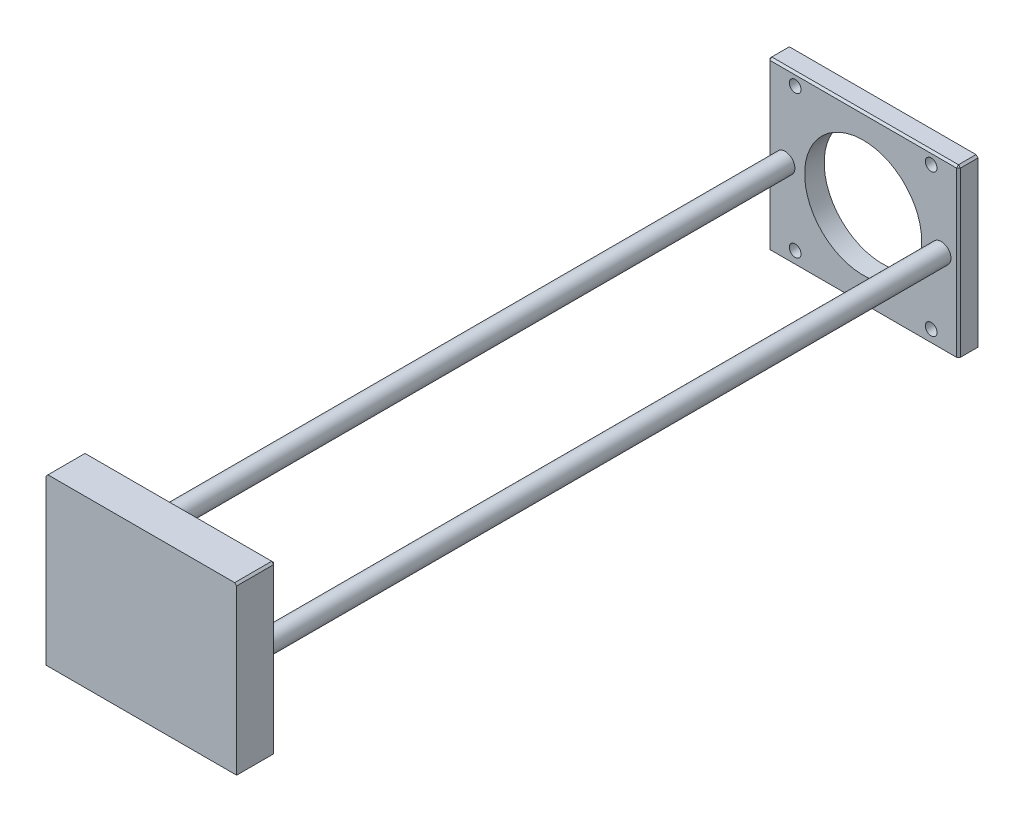
ISO-10303-21;
HEADER;
FILE_DESCRIPTION(('STEP AP214'),'2;1');
FILE_NAME('part.step','',(''),(''),'','','');
FILE_SCHEMA(('AUTOMOTIVE_DESIGN { 1 0 10303 214 1 1 1 1 }'));
ENDSEC;
DATA;
#1=APPLICATION_CONTEXT('core data for automotive mechanical design processes');
#2=APPLICATION_PROTOCOL_DEFINITION('international standard','automotive_design',2000,#1);
#3=PRODUCT_CONTEXT('',#1,'mechanical');
#4=PRODUCT('Part','Part','',(#3));
#5=PRODUCT_RELATED_PRODUCT_CATEGORY('part','',(#4));
#6=PRODUCT_DEFINITION_FORMATION('','',#4);
#7=PRODUCT_DEFINITION_CONTEXT('part definition',#1,'design');
#8=PRODUCT_DEFINITION('design','',#6,#7);
#9=PRODUCT_DEFINITION_SHAPE('','',#8);
#10=(LENGTH_UNIT() NAMED_UNIT(*) SI_UNIT(.MILLI.,.METRE.));
#11=(NAMED_UNIT(*) PLANE_ANGLE_UNIT() SI_UNIT($,.RADIAN.));
#12=(NAMED_UNIT(*) SI_UNIT($,.STERADIAN.) SOLID_ANGLE_UNIT());
#13=UNCERTAINTY_MEASURE_WITH_UNIT(LENGTH_MEASURE(1.E-05),#10,'distance_accuracy_value','');
#14=(GEOMETRIC_REPRESENTATION_CONTEXT(3) GLOBAL_UNCERTAINTY_ASSIGNED_CONTEXT((#13)) GLOBAL_UNIT_ASSIGNED_CONTEXT((#10,
#11,#12)) REPRESENTATION_CONTEXT('',''));
#15=CARTESIAN_POINT('',(0.,0.,0.));
#16=DIRECTION('',(0.,0.,1.));
#17=DIRECTION('',(1.,0.,0.));
#18=AXIS2_PLACEMENT_3D('',#15,#16,#17);
#19=CARTESIAN_POINT('',(0.,0.,10.));
#20=DIRECTION('',(0.,0.,1.));
#21=DIRECTION('',(1.,0.,0.));
#22=AXIS2_PLACEMENT_3D('',#19,#20,#21);
#23=PLANE('',#22);
#24=CARTESIAN_POINT('',(40.,0.,10.));
#25=DIRECTION('',(0.,0.,1.));
#26=DIRECTION('',(-1.,0.,0.));
#27=AXIS2_PLACEMENT_3D('',#24,#25,#26);
#28=CIRCLE('',#27,5.);
#29=CARTESIAN_POINT('',(35.,0.,10.));
#30=VERTEX_POINT('',#29);
#31=EDGE_CURVE('E194',#30,#30,#28,.T.);
#32=ORIENTED_EDGE('',*,*,#31,.F.);
#33=EDGE_LOOP('',(#32));
#34=FACE_BOUND('',#33,.T.);
#35=CARTESIAN_POINT('',(-40.,0.,10.));
#36=DIRECTION('',(0.,0.,1.));
#37=DIRECTION('',(1.,0.,0.));
#38=AXIS2_PLACEMENT_3D('',#35,#36,#37);
#39=CIRCLE('',#38,5.);
#40=CARTESIAN_POINT('',(-35.,0.,10.));
#41=VERTEX_POINT('',#40);
#42=EDGE_CURVE('E202',#41,#41,#39,.T.);
#43=ORIENTED_EDGE('',*,*,#42,.F.);
#44=EDGE_LOOP('',(#43));
#45=FACE_BOUND('',#44,.T.);
#46=CARTESIAN_POINT('',(34.85,-36.5,10.));
#47=DIRECTION('',(0.,0.,1.));
#48=DIRECTION('',(1.,0.,0.));
#49=AXIS2_PLACEMENT_3D('',#46,#47,#48);
#50=CIRCLE('',#49,3.);
#51=CARTESIAN_POINT('',(37.85,-36.5,10.));
#52=VERTEX_POINT('',#51);
#53=EDGE_CURVE('E220',#52,#52,#50,.T.);
#54=ORIENTED_EDGE('',*,*,#53,.F.);
#55=EDGE_LOOP('',(#54));
#56=FACE_BOUND('',#55,.T.);
#57=CARTESIAN_POINT('',(0.,0.,10.));
#58=DIRECTION('',(0.,0.,1.));
#59=DIRECTION('',(1.,0.,0.));
#60=AXIS2_PLACEMENT_3D('',#57,#58,#59);
#61=CIRCLE('',#60,30.);
#62=CARTESIAN_POINT('',(30.,0.,10.));
#63=VERTEX_POINT('',#62);
#64=EDGE_CURVE('E236',#63,#63,#61,.T.);
#65=ORIENTED_EDGE('',*,*,#64,.F.);
#66=EDGE_LOOP('',(#65));
#67=FACE_BOUND('',#66,.T.);
#68=DIRECTION('',(-1.,0.,0.));
#69=VECTOR('',#68,1.);
#70=CARTESIAN_POINT('',(-48.85,41.5,10.));
#71=LINE('',#70,#69);
#72=CARTESIAN_POINT('',(47.85,41.5,10.));
#73=VERTEX_POINT('',#72);
#74=CARTESIAN_POINT('',(-47.85,41.5,10.));
#75=VERTEX_POINT('',#74);
#76=EDGE_CURVE('E305',#73,#75,#71,.T.);
#77=ORIENTED_EDGE('',*,*,#76,.T.);
#78=DIRECTION('',(0.,-1.,0.));
#79=VECTOR('',#78,1.);
#80=CARTESIAN_POINT('',(-47.85,-42.5,10.));
#81=LINE('',#80,#79);
#82=CARTESIAN_POINT('',(-47.85,-42.5,10.));
#83=VERTEX_POINT('',#82);
#84=EDGE_CURVE('E311',#75,#83,#81,.T.);
#85=ORIENTED_EDGE('',*,*,#84,.T.);
#86=DIRECTION('',(1.,0.,0.));
#87=VECTOR('',#86,1.);
#88=CARTESIAN_POINT('',(48.85,-42.5,10.));
#89=LINE('',#88,#87);
#90=CARTESIAN_POINT('',(47.85,-42.5,10.));
#91=VERTEX_POINT('',#90);
#92=EDGE_CURVE('E252',#83,#91,#89,.T.);
#93=ORIENTED_EDGE('',*,*,#92,.T.);
#94=DIRECTION('',(0.,1.,0.));
#95=VECTOR('',#94,1.);
#96=CARTESIAN_POINT('',(47.85,42.5,10.));
#97=LINE('',#96,#95);
#98=EDGE_CURVE('E308',#91,#73,#97,.T.);
#99=ORIENTED_EDGE('',*,*,#98,.T.);
#100=EDGE_LOOP('',(#77,#85,#93,#99));
#101=FACE_BOUND('',#100,.T.);
#102=CARTESIAN_POINT('',(-34.85,36.5,10.));
#103=DIRECTION('',(0.,0.,1.));
#104=DIRECTION('',(1.,0.,0.));
#105=AXIS2_PLACEMENT_3D('',#102,#103,#104);
#106=CIRCLE('',#105,3.);
#107=CARTESIAN_POINT('',(-31.85,36.5,10.));
#108=VERTEX_POINT('',#107);
#109=EDGE_CURVE('E244',#108,#108,#106,.T.);
#110=ORIENTED_EDGE('',*,*,#109,.F.);
#111=EDGE_LOOP('',(#110));
#112=FACE_BOUND('',#111,.T.);
#113=CARTESIAN_POINT('',(34.8500000000001,36.5,10.));
#114=DIRECTION('',(0.,0.,1.));
#115=DIRECTION('',(-1.,0.,0.));
#116=AXIS2_PLACEMENT_3D('',#113,#114,#115);
#117=CIRCLE('',#116,3.);
#118=CARTESIAN_POINT('',(31.8500000000001,36.5,10.));
#119=VERTEX_POINT('',#118);
#120=EDGE_CURVE('E228',#119,#119,#117,.T.);
#121=ORIENTED_EDGE('',*,*,#120,.F.);
#122=EDGE_LOOP('',(#121));
#123=FACE_BOUND('',#122,.T.);
#124=CARTESIAN_POINT('',(-34.85,-36.5,10.));
#125=DIRECTION('',(0.,0.,1.));
#126=DIRECTION('',(-1.,0.,0.));
#127=AXIS2_PLACEMENT_3D('',#124,#125,#126);
#128=CIRCLE('',#127,3.);
#129=CARTESIAN_POINT('',(-37.85,-36.5,10.));
#130=VERTEX_POINT('',#129);
#131=EDGE_CURVE('E212',#130,#130,#128,.T.);
#132=ORIENTED_EDGE('',*,*,#131,.F.);
#133=EDGE_LOOP('',(#132));
#134=FACE_BOUND('',#133,.T.);
#135=ADVANCED_FACE('F45',(#34,#45,#56,#67,#101,#112,#123,#134),#23,.T.);
#136=CARTESIAN_POINT('',(0.,0.,0.));
#137=DIRECTION('',(0.,0.,1.));
#138=DIRECTION('',(1.,0.,0.));
#139=AXIS2_PLACEMENT_3D('',#136,#137,#138);
#140=PLANE('',#139);
#141=DIRECTION('',(0.,-1.,0.));
#142=VECTOR('',#141,1.);
#143=CARTESIAN_POINT('',(-48.85,-42.5,0.));
#144=LINE('',#143,#142);
#145=CARTESIAN_POINT('',(-48.85,41.5,0.));
#146=VERTEX_POINT('',#145);
#147=CARTESIAN_POINT('',(-48.85,-42.5,0.));
#148=VERTEX_POINT('',#147);
#149=EDGE_CURVE('E248',#146,#148,#144,.T.);
#150=ORIENTED_EDGE('',*,*,#149,.F.);
#151=DIRECTION('',(-0.707106781186548,-0.707106781186548,0.));
#152=VECTOR('',#151,1.);
#153=CARTESIAN_POINT('',(-48.85,41.5,0.));
#154=LINE('',#153,#152);
#155=CARTESIAN_POINT('',(-47.85,42.5,0.));
#156=VERTEX_POINT('',#155);
#157=EDGE_CURVE('E287',#146,#156,#154,.F.);
#158=ORIENTED_EDGE('',*,*,#157,.T.);
#159=DIRECTION('',(-1.,0.,0.));
#160=VECTOR('',#159,1.);
#161=CARTESIAN_POINT('',(48.85,42.5,0.));
#162=LINE('',#161,#160);
#163=CARTESIAN_POINT('',(47.85,42.5,0.));
#164=VERTEX_POINT('',#163);
#165=EDGE_CURVE('E257',#164,#156,#162,.T.);
#166=ORIENTED_EDGE('',*,*,#165,.F.);
#167=DIRECTION('',(-0.707106781186548,0.707106781186548,0.));
#168=VECTOR('',#167,1.);
#169=CARTESIAN_POINT('',(47.85,42.5,0.));
#170=LINE('',#169,#168);
#171=CARTESIAN_POINT('',(48.85,41.5,0.));
#172=VERTEX_POINT('',#171);
#173=EDGE_CURVE('E284',#164,#172,#170,.F.);
#174=ORIENTED_EDGE('',*,*,#173,.T.);
#175=DIRECTION('',(0.,1.,0.));
#176=VECTOR('',#175,1.);
#177=CARTESIAN_POINT('',(48.85,-42.5,0.));
#178=LINE('',#177,#176);
#179=CARTESIAN_POINT('',(48.85,-42.5,0.));
#180=VERTEX_POINT('',#179);
#181=EDGE_CURVE('E265',#180,#172,#178,.T.);
#182=ORIENTED_EDGE('',*,*,#181,.F.);
#183=DIRECTION('',(1.,0.,0.));
#184=VECTOR('',#183,1.);
#185=CARTESIAN_POINT('',(48.85,-42.5,0.));
#186=LINE('',#185,#184);
#187=EDGE_CURVE('E261',#148,#180,#186,.T.);
#188=ORIENTED_EDGE('',*,*,#187,.F.);
#189=EDGE_LOOP('',(#150,#158,#166,#174,#182,#188));
#190=FACE_BOUND('',#189,.T.);
#191=CARTESIAN_POINT('',(-34.85,36.5,0.));
#192=DIRECTION('',(0.,0.,1.));
#193=DIRECTION('',(1.,0.,0.));
#194=AXIS2_PLACEMENT_3D('',#191,#192,#193);
#195=CIRCLE('',#194,3.);
#196=CARTESIAN_POINT('',(-31.85,36.5,0.));
#197=VERTEX_POINT('',#196);
#198=EDGE_CURVE('E240',#197,#197,#195,.T.);
#199=ORIENTED_EDGE('',*,*,#198,.T.);
#200=EDGE_LOOP('',(#199));
#201=FACE_BOUND('',#200,.T.);
#202=CARTESIAN_POINT('',(0.,0.,0.));
#203=DIRECTION('',(0.,0.,1.));
#204=DIRECTION('',(1.,0.,0.));
#205=AXIS2_PLACEMENT_3D('',#202,#203,#204);
#206=CIRCLE('',#205,30.);
#207=CARTESIAN_POINT('',(30.,0.,0.));
#208=VERTEX_POINT('',#207);
#209=EDGE_CURVE('E232',#208,#208,#206,.T.);
#210=ORIENTED_EDGE('',*,*,#209,.T.);
#211=EDGE_LOOP('',(#210));
#212=FACE_BOUND('',#211,.T.);
#213=CARTESIAN_POINT('',(34.8500000000001,36.5,0.));
#214=DIRECTION('',(0.,0.,1.));
#215=DIRECTION('',(-1.,0.,0.));
#216=AXIS2_PLACEMENT_3D('',#213,#214,#215);
#217=CIRCLE('',#216,3.);
#218=CARTESIAN_POINT('',(31.8500000000001,36.5,0.));
#219=VERTEX_POINT('',#218);
#220=EDGE_CURVE('E224',#219,#219,#217,.T.);
#221=ORIENTED_EDGE('',*,*,#220,.T.);
#222=EDGE_LOOP('',(#221));
#223=FACE_BOUND('',#222,.T.);
#224=CARTESIAN_POINT('',(34.85,-36.5,0.));
#225=DIRECTION('',(0.,0.,1.));
#226=DIRECTION('',(1.,0.,0.));
#227=AXIS2_PLACEMENT_3D('',#224,#225,#226);
#228=CIRCLE('',#227,3.);
#229=CARTESIAN_POINT('',(37.85,-36.5,0.));
#230=VERTEX_POINT('',#229);
#231=EDGE_CURVE('E216',#230,#230,#228,.T.);
#232=ORIENTED_EDGE('',*,*,#231,.T.);
#233=EDGE_LOOP('',(#232));
#234=FACE_BOUND('',#233,.T.);
#235=CARTESIAN_POINT('',(-34.85,-36.5,0.));
#236=DIRECTION('',(0.,0.,1.));
#237=DIRECTION('',(-1.,0.,0.));
#238=AXIS2_PLACEMENT_3D('',#235,#236,#237);
#239=CIRCLE('',#238,3.);
#240=CARTESIAN_POINT('',(-37.85,-36.5,0.));
#241=VERTEX_POINT('',#240);
#242=EDGE_CURVE('E208',#241,#241,#239,.T.);
#243=ORIENTED_EDGE('',*,*,#242,.T.);
#244=EDGE_LOOP('',(#243));
#245=FACE_BOUND('',#244,.T.);
#246=ADVANCED_FACE('F442',(#190,#201,#212,#223,#234,#245),#140,.F.);
#247=CARTESIAN_POINT('',(-48.85,-42.5,10.));
#248=DIRECTION('',(1.,0.,0.));
#249=DIRECTION('',(0.,0.,-1.));
#250=AXIS2_PLACEMENT_3D('',#247,#248,#249);
#251=PLANE('',#250);
#252=DIRECTION('',(0.,1.,0.));
#253=VECTOR('',#252,1.);
#254=CARTESIAN_POINT('',(-48.85,42.5,9.));
#255=LINE('',#254,#253);
#256=CARTESIAN_POINT('',(-48.85,-42.5,9.));
#257=VERTEX_POINT('',#256);
#258=CARTESIAN_POINT('',(-48.85,41.5,9.));
#259=VERTEX_POINT('',#258);
#260=EDGE_CURVE('E277',#257,#259,#255,.T.);
#261=ORIENTED_EDGE('',*,*,#260,.T.);
#262=DIRECTION('',(0.,0.,-1.));
#263=VECTOR('',#262,1.);
#264=CARTESIAN_POINT('',(-48.85,41.5,10.));
#265=LINE('',#264,#263);
#266=EDGE_CURVE('E280',#259,#146,#265,.T.);
#267=ORIENTED_EDGE('',*,*,#266,.T.);
#268=ORIENTED_EDGE('',*,*,#149,.T.);
#269=DIRECTION('',(0.,0.,-1.));
#270=VECTOR('',#269,1.);
#271=CARTESIAN_POINT('',(-48.85,-42.5,10.));
#272=LINE('',#271,#270);
#273=EDGE_CURVE('E274',#257,#148,#272,.T.);
#274=ORIENTED_EDGE('',*,*,#273,.F.);
#275=EDGE_LOOP('',(#261,#267,#268,#274));
#276=FACE_BOUND('',#275,.T.);
#277=ADVANCED_FACE('F448',(#276),#251,.F.);
#278=CARTESIAN_POINT('',(48.85,-42.5,10.));
#279=DIRECTION('',(0.,1.,0.));
#280=DIRECTION('',(-1.,0.,0.));
#281=AXIS2_PLACEMENT_3D('',#278,#279,#280);
#282=PLANE('',#281);
#283=ORIENTED_EDGE('',*,*,#92,.F.);
#284=DIRECTION('',(-0.707106781186548,0.,-0.707106781186548));
#285=VECTOR('',#284,1.);
#286=CARTESIAN_POINT('',(-47.85,-42.5,10.));
#287=LINE('',#286,#285);
#288=EDGE_CURVE('E317',#83,#257,#287,.T.);
#289=ORIENTED_EDGE('',*,*,#288,.T.);
#290=ORIENTED_EDGE('',*,*,#273,.T.);
#291=ORIENTED_EDGE('',*,*,#187,.T.);
#292=DIRECTION('',(0.,0.,-1.));
#293=VECTOR('',#292,1.);
#294=CARTESIAN_POINT('',(48.85,-42.5,10.));
#295=LINE('',#294,#293);
#296=CARTESIAN_POINT('',(48.85,-42.5,9.));
#297=VERTEX_POINT('',#296);
#298=EDGE_CURVE('E256',#297,#180,#295,.T.);
#299=ORIENTED_EDGE('',*,*,#298,.F.);
#300=DIRECTION('',(-0.707106781186548,0.,0.707106781186548));
#301=VECTOR('',#300,1.);
#302=CARTESIAN_POINT('',(47.85,-42.5,10.));
#303=LINE('',#302,#301);
#304=EDGE_CURVE('E314',#297,#91,#303,.T.);
#305=ORIENTED_EDGE('',*,*,#304,.T.);
#306=EDGE_LOOP('',(#283,#289,#290,#291,#299,#305));
#307=FACE_BOUND('',#306,.T.);
#308=ADVANCED_FACE('F464',(#307),#282,.F.);
#309=CARTESIAN_POINT('',(48.85,-42.5,10.));
#310=DIRECTION('',(-1.,0.,0.));
#311=DIRECTION('',(0.,0.,1.));
#312=AXIS2_PLACEMENT_3D('',#309,#310,#311);
#313=PLANE('',#312);
#314=ORIENTED_EDGE('',*,*,#181,.T.);
#315=DIRECTION('',(0.,0.,1.));
#316=VECTOR('',#315,1.);
#317=CARTESIAN_POINT('',(48.85,41.5,10.));
#318=LINE('',#317,#316);
#319=CARTESIAN_POINT('',(48.85,41.5,9.));
#320=VERTEX_POINT('',#319);
#321=EDGE_CURVE('E302',#172,#320,#318,.T.);
#322=ORIENTED_EDGE('',*,*,#321,.T.);
#323=DIRECTION('',(0.,-1.,0.));
#324=VECTOR('',#323,1.);
#325=CARTESIAN_POINT('',(48.85,-42.5,9.));
#326=LINE('',#325,#324);
#327=EDGE_CURVE('E299',#320,#297,#326,.T.);
#328=ORIENTED_EDGE('',*,*,#327,.T.);
#329=ORIENTED_EDGE('',*,*,#298,.T.);
#330=EDGE_LOOP('',(#314,#322,#328,#329));
#331=FACE_BOUND('',#330,.T.);
#332=ADVANCED_FACE('F460',(#331),#313,.F.);
#333=CARTESIAN_POINT('',(48.85,42.5,10.));
#334=DIRECTION('',(0.,-1.,0.));
#335=DIRECTION('',(1.,0.,0.));
#336=AXIS2_PLACEMENT_3D('',#333,#334,#335);
#337=PLANE('',#336);
#338=ORIENTED_EDGE('',*,*,#165,.T.);
#339=DIRECTION('',(0.,0.,1.));
#340=VECTOR('',#339,1.);
#341=CARTESIAN_POINT('',(-47.85,42.5,10.));
#342=LINE('',#341,#340);
#343=CARTESIAN_POINT('',(-47.85,42.5,9.));
#344=VERTEX_POINT('',#343);
#345=EDGE_CURVE('E296',#156,#344,#342,.T.);
#346=ORIENTED_EDGE('',*,*,#345,.T.);
#347=DIRECTION('',(1.,0.,0.));
#348=VECTOR('',#347,1.);
#349=CARTESIAN_POINT('',(48.85,42.5,9.));
#350=LINE('',#349,#348);
#351=CARTESIAN_POINT('',(47.85,42.5,9.));
#352=VERTEX_POINT('',#351);
#353=EDGE_CURVE('E290',#344,#352,#350,.T.);
#354=ORIENTED_EDGE('',*,*,#353,.T.);
#355=DIRECTION('',(0.,0.,-1.));
#356=VECTOR('',#355,1.);
#357=CARTESIAN_POINT('',(47.85,42.5,10.));
#358=LINE('',#357,#356);
#359=EDGE_CURVE('E293',#352,#164,#358,.T.);
#360=ORIENTED_EDGE('',*,*,#359,.T.);
#361=EDGE_LOOP('',(#338,#346,#354,#360));
#362=FACE_BOUND('',#361,.T.);
#363=ADVANCED_FACE('F457',(#362),#337,.F.);
#364=CARTESIAN_POINT('',(-34.85,36.5,10.));
#365=DIRECTION('',(0.,0.,-1.));
#366=DIRECTION('',(-1.,0.,0.));
#367=AXIS2_PLACEMENT_3D('',#364,#365,#366);
#368=CYLINDRICAL_SURFACE('',#367,3.);
#369=ORIENTED_EDGE('',*,*,#109,.T.);
#370=EDGE_LOOP('',(#369));
#371=FACE_BOUND('',#370,.T.);
#372=ORIENTED_EDGE('',*,*,#198,.F.);
#373=EDGE_LOOP('',(#372));
#374=FACE_BOUND('',#373,.T.);
#375=ADVANCED_FACE('F454',(#371,#374),#368,.F.);
#376=CARTESIAN_POINT('',(0.,0.,10.));
#377=DIRECTION('',(0.,0.,-1.));
#378=DIRECTION('',(-1.,0.,0.));
#379=AXIS2_PLACEMENT_3D('',#376,#377,#378);
#380=CYLINDRICAL_SURFACE('',#379,30.);
#381=ORIENTED_EDGE('',*,*,#64,.T.);
#382=EDGE_LOOP('',(#381));
#383=FACE_BOUND('',#382,.T.);
#384=ORIENTED_EDGE('',*,*,#209,.F.);
#385=EDGE_LOOP('',(#384));
#386=FACE_BOUND('',#385,.T.);
#387=ADVANCED_FACE('F758',(#383,#386),#380,.F.);
#388=CARTESIAN_POINT('',(34.8500000000001,36.5,10.));
#389=DIRECTION('',(0.,0.,-1.));
#390=DIRECTION('',(-1.,0.,0.));
#391=AXIS2_PLACEMENT_3D('',#388,#389,#390);
#392=CYLINDRICAL_SURFACE('',#391,3.);
#393=ORIENTED_EDGE('',*,*,#120,.T.);
#394=EDGE_LOOP('',(#393));
#395=FACE_BOUND('',#394,.T.);
#396=ORIENTED_EDGE('',*,*,#220,.F.);
#397=EDGE_LOOP('',(#396));
#398=FACE_BOUND('',#397,.T.);
#399=ADVANCED_FACE('F747',(#395,#398),#392,.F.);
#400=CARTESIAN_POINT('',(34.85,-36.5,10.));
#401=DIRECTION('',(0.,0.,-1.));
#402=DIRECTION('',(-1.,0.,0.));
#403=AXIS2_PLACEMENT_3D('',#400,#401,#402);
#404=CYLINDRICAL_SURFACE('',#403,3.);
#405=ORIENTED_EDGE('',*,*,#53,.T.);
#406=EDGE_LOOP('',(#405));
#407=FACE_BOUND('',#406,.T.);
#408=ORIENTED_EDGE('',*,*,#231,.F.);
#409=EDGE_LOOP('',(#408));
#410=FACE_BOUND('',#409,.T.);
#411=ADVANCED_FACE('F736',(#407,#410),#404,.F.);
#412=CARTESIAN_POINT('',(-34.85,-36.5,10.));
#413=DIRECTION('',(0.,0.,-1.));
#414=DIRECTION('',(-1.,0.,0.));
#415=AXIS2_PLACEMENT_3D('',#412,#413,#414);
#416=CYLINDRICAL_SURFACE('',#415,3.);
#417=ORIENTED_EDGE('',*,*,#131,.T.);
#418=EDGE_LOOP('',(#417));
#419=FACE_BOUND('',#418,.T.);
#420=ORIENTED_EDGE('',*,*,#242,.F.);
#421=EDGE_LOOP('',(#420));
#422=FACE_BOUND('',#421,.T.);
#423=ADVANCED_FACE('F725',(#419,#422),#416,.F.);
#424=CARTESIAN_POINT('',(-40.,0.,360.));
#425=DIRECTION('',(0.,0.,-1.));
#426=DIRECTION('',(-1.,0.,0.));
#427=AXIS2_PLACEMENT_3D('',#424,#425,#426);
#428=CYLINDRICAL_SURFACE('',#427,5.);
#429=CARTESIAN_POINT('',(-40.,0.,360.));
#430=DIRECTION('',(0.,0.,1.));
#431=DIRECTION('',(1.,0.,0.));
#432=AXIS2_PLACEMENT_3D('',#429,#430,#431);
#433=CIRCLE('',#432,5.);
#434=CARTESIAN_POINT('',(-35.,0.,360.));
#435=VERTEX_POINT('',#434);
#436=EDGE_CURVE('E204',#435,#435,#433,.T.);
#437=ORIENTED_EDGE('',*,*,#436,.F.);
#438=EDGE_LOOP('',(#437));
#439=FACE_BOUND('',#438,.T.);
#440=ORIENTED_EDGE('',*,*,#42,.T.);
#441=EDGE_LOOP('',(#440));
#442=FACE_BOUND('',#441,.T.);
#443=ADVANCED_FACE('F714',(#439,#442),#428,.T.);
#444=CARTESIAN_POINT('',(40.,0.,360.));
#445=DIRECTION('',(0.,0.,-1.));
#446=DIRECTION('',(-1.,0.,0.));
#447=AXIS2_PLACEMENT_3D('',#444,#445,#446);
#448=CYLINDRICAL_SURFACE('',#447,5.);
#449=CARTESIAN_POINT('',(40.,0.,360.));
#450=DIRECTION('',(0.,0.,1.));
#451=DIRECTION('',(-1.,0.,0.));
#452=AXIS2_PLACEMENT_3D('',#449,#450,#451);
#453=CIRCLE('',#452,5.);
#454=CARTESIAN_POINT('',(35.,0.,360.));
#455=VERTEX_POINT('',#454);
#456=EDGE_CURVE('E189',#455,#455,#453,.T.);
#457=ORIENTED_EDGE('',*,*,#456,.F.);
#458=EDGE_LOOP('',(#457));
#459=FACE_BOUND('',#458,.T.);
#460=ORIENTED_EDGE('',*,*,#31,.T.);
#461=EDGE_LOOP('',(#460));
#462=FACE_BOUND('',#461,.T.);
#463=ADVANCED_FACE('F703',(#459,#462),#448,.T.);
#464=CARTESIAN_POINT('',(-48.85,42.5,380.));
#465=DIRECTION('',(1.,0.,0.));
#466=DIRECTION('',(0.,0.,-1.));
#467=AXIS2_PLACEMENT_3D('',#464,#465,#466);
#468=PLANE('',#467);
#469=DIRECTION('',(0.,0.,-1.));
#470=VECTOR('',#469,1.);
#471=CARTESIAN_POINT('',(-48.85,41.5,380.));
#472=LINE('',#471,#470);
#473=CARTESIAN_POINT('',(-48.85,41.5,380.));
#474=VERTEX_POINT('',#473);
#475=CARTESIAN_POINT('',(-48.85,41.5,361.));
#476=VERTEX_POINT('',#475);
#477=EDGE_CURVE('E320',#474,#476,#472,.T.);
#478=ORIENTED_EDGE('',*,*,#477,.T.);
#479=DIRECTION('',(0.,-1.,0.));
#480=VECTOR('',#479,1.);
#481=CARTESIAN_POINT('',(-48.85,42.5,361.));
#482=LINE('',#481,#480);
#483=CARTESIAN_POINT('',(-48.85,-42.5,361.));
#484=VERTEX_POINT('',#483);
#485=EDGE_CURVE('E187',#476,#484,#482,.T.);
#486=ORIENTED_EDGE('',*,*,#485,.T.);
#487=DIRECTION('',(0.,0.,-1.));
#488=VECTOR('',#487,1.);
#489=CARTESIAN_POINT('',(-48.85,-42.5,380.));
#490=LINE('',#489,#488);
#491=CARTESIAN_POINT('',(-48.85,-42.5,380.));
#492=VERTEX_POINT('',#491);
#493=EDGE_CURVE('E177',#492,#484,#490,.T.);
#494=ORIENTED_EDGE('',*,*,#493,.F.);
#495=DIRECTION('',(0.,-1.,0.));
#496=VECTOR('',#495,1.);
#497=CARTESIAN_POINT('',(-48.85,42.5,380.));
#498=LINE('',#497,#496);
#499=EDGE_CURVE('E160',#474,#492,#498,.T.);
#500=ORIENTED_EDGE('',*,*,#499,.F.);
#501=EDGE_LOOP('',(#478,#486,#494,#500));
#502=FACE_BOUND('',#501,.T.);
#503=ADVANCED_FACE('F185',(#502),#468,.F.);
#504=CARTESIAN_POINT('',(-48.85,-42.5,380.));
#505=DIRECTION('',(0.,1.,0.));
#506=DIRECTION('',(0.,0.,1.));
#507=AXIS2_PLACEMENT_3D('',#504,#505,#506);
#508=PLANE('',#507);
#509=ORIENTED_EDGE('',*,*,#493,.T.);
#510=DIRECTION('',(-0.707106781186528,0.,0.707106781186567));
#511=VECTOR('',#510,1.);
#512=CARTESIAN_POINT('',(-48.85,-42.5,361.));
#513=LINE('',#512,#511);
#514=CARTESIAN_POINT('',(-47.85,-42.5,360.));
#515=VERTEX_POINT('',#514);
#516=EDGE_CURVE('E328',#484,#515,#513,.F.);
#517=ORIENTED_EDGE('',*,*,#516,.T.);
#518=DIRECTION('',(1.,0.,0.));
#519=VECTOR('',#518,1.);
#520=CARTESIAN_POINT('',(-48.85,-42.5,360.));
#521=LINE('',#520,#519);
#522=CARTESIAN_POINT('',(47.85,-42.5,360.));
#523=VERTEX_POINT('',#522);
#524=EDGE_CURVE('E172',#515,#523,#521,.T.);
#525=ORIENTED_EDGE('',*,*,#524,.T.);
#526=DIRECTION('',(-0.707106781186528,0.,-0.707106781186567));
#527=VECTOR('',#526,1.);
#528=CARTESIAN_POINT('',(48.85,-42.5,361.));
#529=LINE('',#528,#527);
#530=CARTESIAN_POINT('',(48.85,-42.5,361.));
#531=VERTEX_POINT('',#530);
#532=EDGE_CURVE('E325',#523,#531,#529,.F.);
#533=ORIENTED_EDGE('',*,*,#532,.T.);
#534=DIRECTION('',(0.,0.,-1.));
#535=VECTOR('',#534,1.);
#536=CARTESIAN_POINT('',(48.85,-42.5,380.));
#537=LINE('',#536,#535);
#538=CARTESIAN_POINT('',(48.85,-42.5,380.));
#539=VERTEX_POINT('',#538);
#540=EDGE_CURVE('E179',#539,#531,#537,.T.);
#541=ORIENTED_EDGE('',*,*,#540,.F.);
#542=DIRECTION('',(1.,0.,0.));
#543=VECTOR('',#542,1.);
#544=CARTESIAN_POINT('',(-48.85,-42.5,380.));
#545=LINE('',#544,#543);
#546=EDGE_CURVE('E165',#492,#539,#545,.T.);
#547=ORIENTED_EDGE('',*,*,#546,.F.);
#548=EDGE_LOOP('',(#509,#517,#525,#533,#541,#547));
#549=FACE_BOUND('',#548,.T.);
#550=ADVANCED_FACE('F176',(#549),#508,.F.);
#551=CARTESIAN_POINT('',(48.85,42.5,380.));
#552=DIRECTION('',(-1.,0.,0.));
#553=DIRECTION('',(0.,0.,1.));
#554=AXIS2_PLACEMENT_3D('',#551,#552,#553);
#555=PLANE('',#554);
#556=ORIENTED_EDGE('',*,*,#540,.T.);
#557=DIRECTION('',(0.,1.,0.));
#558=VECTOR('',#557,1.);
#559=CARTESIAN_POINT('',(48.85,42.5,361.));
#560=LINE('',#559,#558);
#561=CARTESIAN_POINT('',(48.85,41.5,361.));
#562=VERTEX_POINT('',#561);
#563=EDGE_CURVE('E343',#531,#562,#560,.T.);
#564=ORIENTED_EDGE('',*,*,#563,.T.);
#565=DIRECTION('',(0.,0.,1.));
#566=VECTOR('',#565,1.);
#567=CARTESIAN_POINT('',(48.85,41.5,380.));
#568=LINE('',#567,#566);
#569=CARTESIAN_POINT('',(48.85,41.5,380.));
#570=VERTEX_POINT('',#569);
#571=EDGE_CURVE('E340',#562,#570,#568,.T.);
#572=ORIENTED_EDGE('',*,*,#571,.T.);
#573=DIRECTION('',(0.,1.,0.));
#574=VECTOR('',#573,1.);
#575=CARTESIAN_POINT('',(48.85,42.5,380.));
#576=LINE('',#575,#574);
#577=EDGE_CURVE('E182',#539,#570,#576,.T.);
#578=ORIENTED_EDGE('',*,*,#577,.F.);
#579=EDGE_LOOP('',(#556,#564,#572,#578));
#580=FACE_BOUND('',#579,.T.);
#581=ADVANCED_FACE('F430',(#580),#555,.F.);
#582=CARTESIAN_POINT('',(-48.85,42.5,380.));
#583=DIRECTION('',(0.,-1.,0.));
#584=DIRECTION('',(0.,0.,-1.));
#585=AXIS2_PLACEMENT_3D('',#582,#583,#584);
#586=PLANE('',#585);
#587=DIRECTION('',(-1.,0.,0.));
#588=VECTOR('',#587,1.);
#589=CARTESIAN_POINT('',(-48.85,42.5,361.));
#590=LINE('',#589,#588);
#591=CARTESIAN_POINT('',(47.85,42.5,361.));
#592=VERTEX_POINT('',#591);
#593=CARTESIAN_POINT('',(-47.8499999999999,42.5,361.));
#594=VERTEX_POINT('',#593);
#595=EDGE_CURVE('E64',#592,#594,#590,.T.);
#596=ORIENTED_EDGE('',*,*,#595,.T.);
#597=DIRECTION('',(0.,0.,1.));
#598=VECTOR('',#597,1.);
#599=CARTESIAN_POINT('',(-47.8499999999999,42.5,380.));
#600=LINE('',#599,#598);
#601=CARTESIAN_POINT('',(-47.8499999999999,42.5,380.));
#602=VERTEX_POINT('',#601);
#603=EDGE_CURVE('E350',#594,#602,#600,.T.);
#604=ORIENTED_EDGE('',*,*,#603,.T.);
#605=DIRECTION('',(-1.,0.,0.));
#606=VECTOR('',#605,1.);
#607=CARTESIAN_POINT('',(-48.85,42.5,380.));
#608=LINE('',#607,#606);
#609=CARTESIAN_POINT('',(47.8499999999999,42.5,380.));
#610=VERTEX_POINT('',#609);
#611=EDGE_CURVE('E196',#610,#602,#608,.T.);
#612=ORIENTED_EDGE('',*,*,#611,.F.);
#613=DIRECTION('',(0.,0.,-1.));
#614=VECTOR('',#613,1.);
#615=CARTESIAN_POINT('',(47.85,42.5,380.));
#616=LINE('',#615,#614);
#617=EDGE_CURVE('E69',#610,#592,#616,.T.);
#618=ORIENTED_EDGE('',*,*,#617,.T.);
#619=EDGE_LOOP('',(#596,#604,#612,#618));
#620=FACE_BOUND('',#619,.T.);
#621=ADVANCED_FACE('F416',(#620),#586,.F.);
#622=CARTESIAN_POINT('',(0.,0.,380.));
#623=DIRECTION('',(0.,0.,1.));
#624=DIRECTION('',(1.,0.,0.));
#625=AXIS2_PLACEMENT_3D('',#622,#623,#624);
#626=PLANE('',#625);
#627=ORIENTED_EDGE('',*,*,#611,.T.);
#628=DIRECTION('',(0.707106781186567,0.707106781186528,0.));
#629=VECTOR('',#628,1.);
#630=CARTESIAN_POINT('',(-45.1749999999986,45.1750000000011,380.));
#631=LINE('',#630,#629);
#632=EDGE_CURVE('E11',#602,#474,#631,.F.);
#633=ORIENTED_EDGE('',*,*,#632,.T.);
#634=ORIENTED_EDGE('',*,*,#499,.T.);
#635=ORIENTED_EDGE('',*,*,#546,.T.);
#636=ORIENTED_EDGE('',*,*,#577,.T.);
#637=DIRECTION('',(0.707106781186567,-0.707106781186528,0.));
#638=VECTOR('',#637,1.);
#639=CARTESIAN_POINT('',(45.1749999999986,45.1750000000012,380.));
#640=LINE('',#639,#638);
#641=EDGE_CURVE('E56',#570,#610,#640,.F.);
#642=ORIENTED_EDGE('',*,*,#641,.T.);
#643=EDGE_LOOP('',(#627,#633,#634,#635,#636,#642));
#644=FACE_BOUND('',#643,.T.);
#645=ADVANCED_FACE('F163',(#644),#626,.T.);
#646=CARTESIAN_POINT('',(0.,0.,360.));
#647=DIRECTION('',(0.,0.,1.));
#648=DIRECTION('',(1.,0.,0.));
#649=AXIS2_PLACEMENT_3D('',#646,#647,#648);
#650=PLANE('',#649);
#651=ORIENTED_EDGE('',*,*,#524,.F.);
#652=DIRECTION('',(0.,1.,0.));
#653=VECTOR('',#652,1.);
#654=CARTESIAN_POINT('',(-47.85,0.,360.));
#655=LINE('',#654,#653);
#656=CARTESIAN_POINT('',(-47.85,41.5,360.));
#657=VERTEX_POINT('',#656);
#658=EDGE_CURVE('E337',#515,#657,#655,.T.);
#659=ORIENTED_EDGE('',*,*,#658,.T.);
#660=DIRECTION('',(1.,0.,0.));
#661=VECTOR('',#660,1.);
#662=CARTESIAN_POINT('',(0.,41.5,360.));
#663=LINE('',#662,#661);
#664=CARTESIAN_POINT('',(47.85,41.5,360.));
#665=VERTEX_POINT('',#664);
#666=EDGE_CURVE('E331',#657,#665,#663,.T.);
#667=ORIENTED_EDGE('',*,*,#666,.T.);
#668=DIRECTION('',(0.,-1.,0.));
#669=VECTOR('',#668,1.);
#670=CARTESIAN_POINT('',(47.85,0.,360.));
#671=LINE('',#670,#669);
#672=EDGE_CURVE('E334',#665,#523,#671,.T.);
#673=ORIENTED_EDGE('',*,*,#672,.T.);
#674=EDGE_LOOP('',(#651,#659,#667,#673));
#675=FACE_BOUND('',#674,.T.);
#676=ORIENTED_EDGE('',*,*,#436,.T.);
#677=EDGE_LOOP('',(#676));
#678=FACE_BOUND('',#677,.T.);
#679=ORIENTED_EDGE('',*,*,#456,.T.);
#680=EDGE_LOOP('',(#679));
#681=FACE_BOUND('',#680,.T.);
#682=ADVANCED_FACE('F519',(#675,#678,#681),#650,.F.);
#683=CARTESIAN_POINT('',(47.85,42.5,10.));
#684=DIRECTION('',(-0.707106781186547,-0.707106781186547,0.));
#685=DIRECTION('',(0.,0.,-1.));
#686=AXIS2_PLACEMENT_3D('',#683,#684,#685);
#687=PLANE('',#686);
#688=ORIENTED_EDGE('',*,*,#173,.F.);
#689=ORIENTED_EDGE('',*,*,#359,.F.);
#690=DIRECTION('',(0.707106781186547,-0.707106781186547,0.));
#691=VECTOR('',#690,1.);
#692=CARTESIAN_POINT('',(48.85,41.5,9.));
#693=LINE('',#692,#691);
#694=EDGE_CURVE('E375',#320,#352,#693,.F.);
#695=ORIENTED_EDGE('',*,*,#694,.F.);
#696=ORIENTED_EDGE('',*,*,#321,.F.);
#697=EDGE_LOOP('',(#688,#689,#695,#696));
#698=FACE_BOUND('',#697,.T.);
#699=ADVANCED_FACE('F513',(#698),#687,.F.);
#700=CARTESIAN_POINT('',(47.85,0.,10.));
#701=DIRECTION('',(0.707106781186547,0.,0.707106781186547));
#702=DIRECTION('',(0.,-1.,0.));
#703=AXIS2_PLACEMENT_3D('',#700,#701,#702);
#704=PLANE('',#703);
#705=ORIENTED_EDGE('',*,*,#304,.F.);
#706=ORIENTED_EDGE('',*,*,#327,.F.);
#707=DIRECTION('',(0.707106781186547,0.,-0.707106781186547));
#708=VECTOR('',#707,1.);
#709=CARTESIAN_POINT('',(48.85,41.5,9.));
#710=LINE('',#709,#708);
#711=EDGE_CURVE('E371',#73,#320,#710,.T.);
#712=ORIENTED_EDGE('',*,*,#711,.F.);
#713=ORIENTED_EDGE('',*,*,#98,.F.);
#714=EDGE_LOOP('',(#705,#706,#712,#713));
#715=FACE_BOUND('',#714,.T.);
#716=ADVANCED_FACE('F506',(#715),#704,.T.);
#717=CARTESIAN_POINT('',(48.85,41.5,9.));
#718=DIRECTION('',(0.577350269189626,0.577350269189626,0.577350269189626));
#719=DIRECTION('',(0.707106781186547,0.,-0.707106781186547));
#720=AXIS2_PLACEMENT_3D('',#717,#718,#719);
#721=PLANE('',#720);
#722=ORIENTED_EDGE('',*,*,#711,.T.);
#723=ORIENTED_EDGE('',*,*,#694,.T.);
#724=DIRECTION('',(0.,-0.707106781186548,0.707106781186548));
#725=VECTOR('',#724,1.);
#726=CARTESIAN_POINT('',(47.85,42.,9.5));
#727=LINE('',#726,#725);
#728=EDGE_CURVE('E367',#73,#352,#727,.F.);
#729=ORIENTED_EDGE('',*,*,#728,.F.);
#730=EDGE_LOOP('',(#722,#723,#729));
#731=FACE_BOUND('',#730,.T.);
#732=ADVANCED_FACE('F499',(#731),#721,.T.);
#733=CARTESIAN_POINT('',(0.,41.5,10.));
#734=DIRECTION('',(0.,0.707106781186547,0.707106781186547));
#735=DIRECTION('',(1.,0.,0.));
#736=AXIS2_PLACEMENT_3D('',#733,#734,#735);
#737=PLANE('',#736);
#738=ORIENTED_EDGE('',*,*,#728,.T.);
#739=ORIENTED_EDGE('',*,*,#353,.F.);
#740=DIRECTION('',(0.,0.707106781186547,-0.707106781186547));
#741=VECTOR('',#740,1.);
#742=CARTESIAN_POINT('',(-47.85,42.5,9.));
#743=LINE('',#742,#741);
#744=EDGE_CURVE('E363',#75,#344,#743,.T.);
#745=ORIENTED_EDGE('',*,*,#744,.F.);
#746=ORIENTED_EDGE('',*,*,#76,.F.);
#747=EDGE_LOOP('',(#738,#739,#745,#746));
#748=FACE_BOUND('',#747,.T.);
#749=ADVANCED_FACE('F492',(#748),#737,.T.);
#750=CARTESIAN_POINT('',(-47.85,0.,10.));
#751=DIRECTION('',(-0.707106781186547,0.,0.707106781186547));
#752=DIRECTION('',(0.,1.,0.));
#753=AXIS2_PLACEMENT_3D('',#750,#751,#752);
#754=PLANE('',#753);
#755=ORIENTED_EDGE('',*,*,#288,.F.);
#756=ORIENTED_EDGE('',*,*,#84,.F.);
#757=DIRECTION('',(0.707106781186547,0.,0.707106781186547));
#758=VECTOR('',#757,1.);
#759=CARTESIAN_POINT('',(-48.35,41.5,9.5));
#760=LINE('',#759,#758);
#761=EDGE_CURVE('E359',#259,#75,#760,.T.);
#762=ORIENTED_EDGE('',*,*,#761,.F.);
#763=ORIENTED_EDGE('',*,*,#260,.F.);
#764=EDGE_LOOP('',(#755,#756,#762,#763));
#765=FACE_BOUND('',#764,.T.);
#766=ADVANCED_FACE('F485',(#765),#754,.T.);
#767=CARTESIAN_POINT('',(-47.85,42.5,9.));
#768=DIRECTION('',(-0.577350269189626,0.577350269189626,0.577350269189626));
#769=DIRECTION('',(0.707106781186547,0.,0.707106781186547));
#770=AXIS2_PLACEMENT_3D('',#767,#768,#769);
#771=PLANE('',#770);
#772=ORIENTED_EDGE('',*,*,#761,.T.);
#773=ORIENTED_EDGE('',*,*,#744,.T.);
#774=DIRECTION('',(0.707106781186547,0.707106781186547,0.));
#775=VECTOR('',#774,1.);
#776=CARTESIAN_POINT('',(-47.85,42.5,9.));
#777=LINE('',#776,#775);
#778=EDGE_CURVE('E355',#259,#344,#777,.T.);
#779=ORIENTED_EDGE('',*,*,#778,.F.);
#780=EDGE_LOOP('',(#772,#773,#779));
#781=FACE_BOUND('',#780,.T.);
#782=ADVANCED_FACE('F478',(#781),#771,.T.);
#783=CARTESIAN_POINT('',(-48.85,41.5,10.));
#784=DIRECTION('',(0.707106781186547,-0.707106781186547,0.));
#785=DIRECTION('',(0.,0.,-1.));
#786=AXIS2_PLACEMENT_3D('',#783,#784,#785);
#787=PLANE('',#786);
#788=ORIENTED_EDGE('',*,*,#778,.T.);
#789=ORIENTED_EDGE('',*,*,#345,.F.);
#790=ORIENTED_EDGE('',*,*,#157,.F.);
#791=ORIENTED_EDGE('',*,*,#266,.F.);
#792=EDGE_LOOP('',(#788,#789,#790,#791));
#793=FACE_BOUND('',#792,.T.);
#794=ADVANCED_FACE('F439',(#793),#787,.F.);
#795=CARTESIAN_POINT('',(48.85,42.5,361.));
#796=DIRECTION('',(-0.707106781186567,0.,0.707106781186528));
#797=DIRECTION('',(0.,1.,0.));
#798=AXIS2_PLACEMENT_3D('',#795,#796,#797);
#799=PLANE('',#798);
#800=ORIENTED_EDGE('',*,*,#532,.F.);
#801=ORIENTED_EDGE('',*,*,#672,.F.);
#802=DIRECTION('',(0.707106781186528,0.,0.707106781186567));
#803=VECTOR('',#802,1.);
#804=CARTESIAN_POINT('',(48.85,41.5,361.));
#805=LINE('',#804,#803);
#806=EDGE_CURVE('E50',#562,#665,#805,.F.);
#807=ORIENTED_EDGE('',*,*,#806,.F.);
#808=ORIENTED_EDGE('',*,*,#563,.F.);
#809=EDGE_LOOP('',(#800,#801,#807,#808));
#810=FACE_BOUND('',#809,.T.);
#811=ADVANCED_FACE('F48',(#810),#799,.F.);
#812=CARTESIAN_POINT('',(47.85,42.5,380.));
#813=DIRECTION('',(-0.707106781186528,-0.707106781186567,0.));
#814=DIRECTION('',(0.,0.,-1.));
#815=AXIS2_PLACEMENT_3D('',#812,#813,#814);
#816=PLANE('',#815);
#817=ORIENTED_EDGE('',*,*,#641,.F.);
#818=ORIENTED_EDGE('',*,*,#571,.F.);
#819=DIRECTION('',(-0.707106781186567,0.707106781186528,0.));
#820=VECTOR('',#819,1.);
#821=CARTESIAN_POINT('',(48.85,41.5,361.));
#822=LINE('',#821,#820);
#823=EDGE_CURVE('E394',#592,#562,#822,.F.);
#824=ORIENTED_EDGE('',*,*,#823,.F.);
#825=ORIENTED_EDGE('',*,*,#617,.F.);
#826=EDGE_LOOP('',(#817,#818,#824,#825));
#827=FACE_BOUND('',#826,.T.);
#828=ADVANCED_FACE('F432',(#827),#816,.F.);
#829=CARTESIAN_POINT('',(48.85,41.5,361.));
#830=DIRECTION('',(0.577350269189626,0.577350269189658,-0.577350269189594));
#831=DIRECTION('',(-0.707106781186567,0.707106781186528,0.));
#832=AXIS2_PLACEMENT_3D('',#829,#830,#831);
#833=PLANE('',#832);
#834=ORIENTED_EDGE('',*,*,#823,.T.);
#835=ORIENTED_EDGE('',*,*,#806,.T.);
#836=DIRECTION('',(0.,-0.707106781186528,-0.707106781186567));
#837=VECTOR('',#836,1.);
#838=CARTESIAN_POINT('',(47.85,42.,360.5));
#839=LINE('',#838,#837);
#840=EDGE_CURVE('E391',#592,#665,#839,.T.);
#841=ORIENTED_EDGE('',*,*,#840,.F.);
#842=EDGE_LOOP('',(#834,#835,#841));
#843=FACE_BOUND('',#842,.T.);
#844=ADVANCED_FACE('F402',(#843),#833,.T.);
#845=CARTESIAN_POINT('',(-48.85,42.5,361.));
#846=DIRECTION('',(0.,-0.707106781186567,0.707106781186528));
#847=DIRECTION('',(-1.,0.,0.));
#848=AXIS2_PLACEMENT_3D('',#845,#846,#847);
#849=PLANE('',#848);
#850=ORIENTED_EDGE('',*,*,#840,.T.);
#851=ORIENTED_EDGE('',*,*,#666,.F.);
#852=DIRECTION('',(0.,0.707106781186528,0.707106781186567));
#853=VECTOR('',#852,1.);
#854=CARTESIAN_POINT('',(-47.85,41.5,360.));
#855=LINE('',#854,#853);
#856=EDGE_CURVE('E387',#594,#657,#855,.F.);
#857=ORIENTED_EDGE('',*,*,#856,.F.);
#858=ORIENTED_EDGE('',*,*,#595,.F.);
#859=EDGE_LOOP('',(#850,#851,#857,#858));
#860=FACE_BOUND('',#859,.T.);
#861=ADVANCED_FACE('F408',(#860),#849,.F.);
#862=CARTESIAN_POINT('',(-48.85,41.5,380.));
#863=DIRECTION('',(0.707106781186528,-0.707106781186567,0.));
#864=DIRECTION('',(0.,0.,-1.));
#865=AXIS2_PLACEMENT_3D('',#862,#863,#864);
#866=PLANE('',#865);
#867=ORIENTED_EDGE('',*,*,#632,.F.);
#868=ORIENTED_EDGE('',*,*,#603,.F.);
#869=DIRECTION('',(-0.707106781186567,-0.707106781186528,0.));
#870=VECTOR('',#869,1.);
#871=CARTESIAN_POINT('',(-48.35,42.,361.));
#872=LINE('',#871,#870);
#873=EDGE_CURVE('E383',#476,#594,#872,.F.);
#874=ORIENTED_EDGE('',*,*,#873,.F.);
#875=ORIENTED_EDGE('',*,*,#477,.F.);
#876=EDGE_LOOP('',(#867,#868,#874,#875));
#877=FACE_BOUND('',#876,.T.);
#878=ADVANCED_FACE('F415',(#877),#866,.F.);
#879=CARTESIAN_POINT('',(-47.85,41.5,360.));
#880=DIRECTION('',(-0.577350269189626,0.577350269189658,-0.577350269189594));
#881=DIRECTION('',(-0.707106781186567,-0.707106781186528,0.));
#882=AXIS2_PLACEMENT_3D('',#879,#880,#881);
#883=PLANE('',#882);
#884=ORIENTED_EDGE('',*,*,#873,.T.);
#885=ORIENTED_EDGE('',*,*,#856,.T.);
#886=DIRECTION('',(0.707106781186528,0.,-0.707106781186567));
#887=VECTOR('',#886,1.);
#888=CARTESIAN_POINT('',(-47.85,41.5,360.));
#889=LINE('',#888,#887);
#890=EDGE_CURVE('E379',#476,#657,#889,.T.);
#891=ORIENTED_EDGE('',*,*,#890,.F.);
#892=EDGE_LOOP('',(#884,#885,#891));
#893=FACE_BOUND('',#892,.T.);
#894=ADVANCED_FACE('F413',(#893),#883,.T.);
#895=CARTESIAN_POINT('',(-48.85,42.5,361.));
#896=DIRECTION('',(0.707106781186567,0.,0.707106781186528));
#897=DIRECTION('',(0.,-1.,0.));
#898=AXIS2_PLACEMENT_3D('',#895,#896,#897);
#899=PLANE('',#898);
#900=ORIENTED_EDGE('',*,*,#890,.T.);
#901=ORIENTED_EDGE('',*,*,#658,.F.);
#902=ORIENTED_EDGE('',*,*,#516,.F.);
#903=ORIENTED_EDGE('',*,*,#485,.F.);
#904=EDGE_LOOP('',(#900,#901,#902,#903));
#905=FACE_BOUND('',#904,.T.);
#906=ADVANCED_FACE('F522',(#905),#899,.F.);
#907=CLOSED_SHELL('',(#135,#246,#277,#308,#332,#363,#375,#387,#399,#411,#423,#443,#463,#503,
#550,#581,#621,#645,#682,#699,#716,#732,#749,#766,#782,#794,#811,#828,#844,#861,#878,#894,#906));
#908=MANIFOLD_SOLID_BREP('B2',#907);
#909=ADVANCED_BREP_SHAPE_REPRESENTATION('',(#18,#908),#14);
#910=SHAPE_DEFINITION_REPRESENTATION(#9,#909);
ENDSEC;
END-ISO-10303-21;
